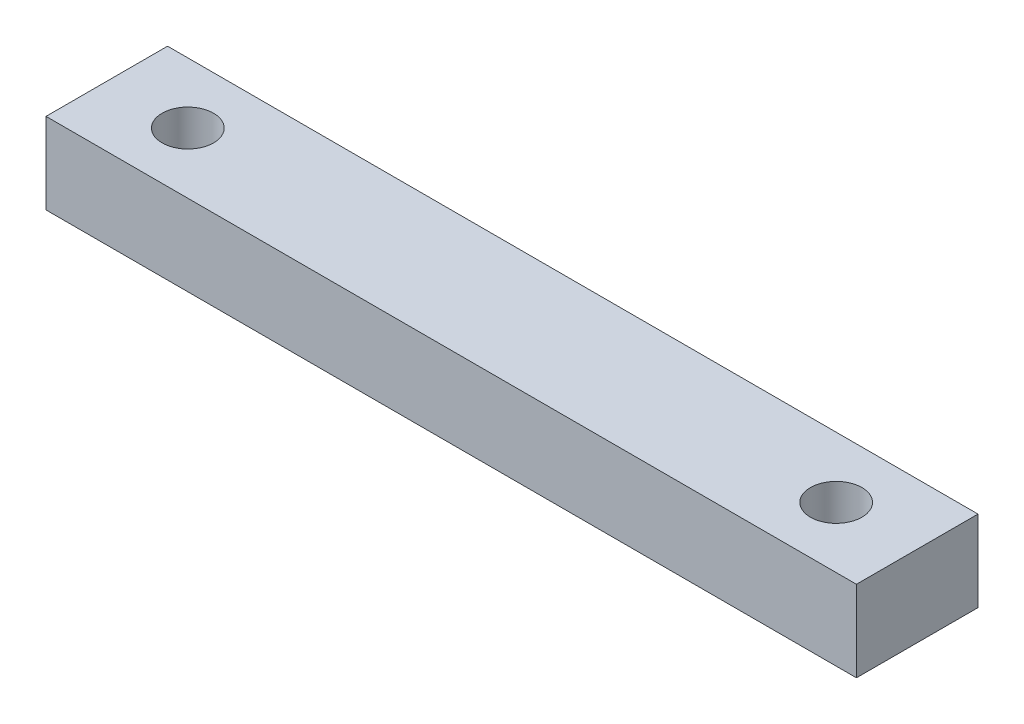
ISO-10303-21;
HEADER;
FILE_DESCRIPTION(('STEP AP214'),'2;1');
FILE_NAME('part.step','',(''),(''),'','','');
FILE_SCHEMA(('AUTOMOTIVE_DESIGN { 1 0 10303 214 1 1 1 1 }'));
ENDSEC;
DATA;
#1=APPLICATION_CONTEXT('core data for automotive mechanical design processes');
#2=APPLICATION_PROTOCOL_DEFINITION('international standard','automotive_design',2000,#1);
#3=PRODUCT_CONTEXT('',#1,'mechanical');
#4=PRODUCT('Part','Part','',(#3));
#5=PRODUCT_RELATED_PRODUCT_CATEGORY('part','',(#4));
#6=PRODUCT_DEFINITION_FORMATION('','',#4);
#7=PRODUCT_DEFINITION_CONTEXT('part definition',#1,'design');
#8=PRODUCT_DEFINITION('design','',#6,#7);
#9=PRODUCT_DEFINITION_SHAPE('','',#8);
#10=(LENGTH_UNIT() NAMED_UNIT(*) SI_UNIT(.MILLI.,.METRE.));
#11=(NAMED_UNIT(*) PLANE_ANGLE_UNIT() SI_UNIT($,.RADIAN.));
#12=(NAMED_UNIT(*) SI_UNIT($,.STERADIAN.) SOLID_ANGLE_UNIT());
#13=UNCERTAINTY_MEASURE_WITH_UNIT(LENGTH_MEASURE(1.E-05),#10,'distance_accuracy_value','');
#14=(GEOMETRIC_REPRESENTATION_CONTEXT(3) GLOBAL_UNCERTAINTY_ASSIGNED_CONTEXT((#13)) GLOBAL_UNIT_ASSIGNED_CONTEXT((#10,
#11,#12)) REPRESENTATION_CONTEXT('',''));
#15=CARTESIAN_POINT('',(0.,0.,0.));
#16=DIRECTION('',(0.,0.,1.));
#17=DIRECTION('',(1.,0.,0.));
#18=AXIS2_PLACEMENT_3D('',#15,#16,#17);
#19=CARTESIAN_POINT('',(0.,10.,0.));
#20=DIRECTION('',(0.,-1.,0.));
#21=DIRECTION('',(0.,0.,-1.));
#22=AXIS2_PLACEMENT_3D('',#19,#20,#21);
#23=PLANE('',#22);
#24=DIRECTION('',(0.,0.,1.));
#25=VECTOR('',#24,1.);
#26=CARTESIAN_POINT('',(0.,10.,0.));
#27=LINE('',#26,#25);
#28=CARTESIAN_POINT('',(0.,10.,-15.));
#29=VERTEX_POINT('',#28);
#30=CARTESIAN_POINT('',(0.,10.,0.));
#31=VERTEX_POINT('',#30);
#32=EDGE_CURVE('E85',#29,#31,#27,.T.);
#33=ORIENTED_EDGE('',*,*,#32,.T.);
#34=DIRECTION('',(1.,0.,0.));
#35=VECTOR('',#34,1.);
#36=CARTESIAN_POINT('',(0.,10.,0.));
#37=LINE('',#36,#35);
#38=CARTESIAN_POINT('',(100.,10.,0.));
#39=VERTEX_POINT('',#38);
#40=EDGE_CURVE('E80',#31,#39,#37,.T.);
#41=ORIENTED_EDGE('',*,*,#40,.T.);
#42=DIRECTION('',(0.,0.,-1.));
#43=VECTOR('',#42,1.);
#44=CARTESIAN_POINT('',(100.,10.,0.));
#45=LINE('',#44,#43);
#46=CARTESIAN_POINT('',(100.,10.,-15.));
#47=VERTEX_POINT('',#46);
#48=EDGE_CURVE('E83',#39,#47,#45,.T.);
#49=ORIENTED_EDGE('',*,*,#48,.T.);
#50=DIRECTION('',(-1.,0.,0.));
#51=VECTOR('',#50,1.);
#52=CARTESIAN_POINT('',(0.,10.,-15.));
#53=LINE('',#52,#51);
#54=EDGE_CURVE('E50',#47,#29,#53,.T.);
#55=ORIENTED_EDGE('',*,*,#54,.T.);
#56=EDGE_LOOP('',(#33,#41,#49,#55));
#57=FACE_BOUND('',#56,.T.);
#58=CARTESIAN_POINT('',(10.,10.,-7.5));
#59=DIRECTION('',(0.,1.,0.));
#60=DIRECTION('',(0.,0.,1.));
#61=AXIS2_PLACEMENT_3D('',#58,#59,#60);
#62=CIRCLE('',#61,3.175);
#63=CARTESIAN_POINT('',(10.,10.,-4.325));
#64=VERTEX_POINT('',#63);
#65=EDGE_CURVE('E100',#64,#64,#62,.T.);
#66=ORIENTED_EDGE('',*,*,#65,.F.);
#67=EDGE_LOOP('',(#66));
#68=FACE_BOUND('',#67,.T.);
#69=CARTESIAN_POINT('',(90.,10.,-7.5));
#70=DIRECTION('',(0.,1.,0.));
#71=DIRECTION('',(0.,0.,-1.));
#72=AXIS2_PLACEMENT_3D('',#69,#70,#71);
#73=CIRCLE('',#72,3.175);
#74=CARTESIAN_POINT('',(90.,10.,-10.675));
#75=VERTEX_POINT('',#74);
#76=EDGE_CURVE('E115',#75,#75,#73,.T.);
#77=ORIENTED_EDGE('',*,*,#76,.F.);
#78=EDGE_LOOP('',(#77));
#79=FACE_BOUND('',#78,.T.);
#80=ADVANCED_FACE('F33',(#57,#68,#79),#23,.F.);
#81=CARTESIAN_POINT('',(0.,0.,0.));
#82=DIRECTION('',(0.,-1.,0.));
#83=DIRECTION('',(0.,0.,-1.));
#84=AXIS2_PLACEMENT_3D('',#81,#82,#83);
#85=PLANE('',#84);
#86=CARTESIAN_POINT('',(10.,0.,-7.5));
#87=DIRECTION('',(0.,1.,0.));
#88=DIRECTION('',(0.,0.,1.));
#89=AXIS2_PLACEMENT_3D('',#86,#87,#88);
#90=CIRCLE('',#89,3.175);
#91=CARTESIAN_POINT('',(10.,0.,-4.325));
#92=VERTEX_POINT('',#91);
#93=EDGE_CURVE('E112',#92,#92,#90,.T.);
#94=ORIENTED_EDGE('',*,*,#93,.T.);
#95=EDGE_LOOP('',(#94));
#96=FACE_BOUND('',#95,.T.);
#97=DIRECTION('',(0.,0.,1.));
#98=VECTOR('',#97,1.);
#99=CARTESIAN_POINT('',(0.,0.,0.));
#100=LINE('',#99,#98);
#101=CARTESIAN_POINT('',(0.,0.,-15.));
#102=VERTEX_POINT('',#101);
#103=CARTESIAN_POINT('',(0.,0.,0.));
#104=VERTEX_POINT('',#103);
#105=EDGE_CURVE('E97',#102,#104,#100,.T.);
#106=ORIENTED_EDGE('',*,*,#105,.F.);
#107=DIRECTION('',(-1.,0.,0.));
#108=VECTOR('',#107,1.);
#109=CARTESIAN_POINT('',(0.,0.,-15.));
#110=LINE('',#109,#108);
#111=CARTESIAN_POINT('',(100.,0.,-15.));
#112=VERTEX_POINT('',#111);
#113=EDGE_CURVE('E73',#112,#102,#110,.T.);
#114=ORIENTED_EDGE('',*,*,#113,.F.);
#115=DIRECTION('',(0.,0.,-1.));
#116=VECTOR('',#115,1.);
#117=CARTESIAN_POINT('',(100.,0.,0.));
#118=LINE('',#117,#116);
#119=CARTESIAN_POINT('',(100.,0.,0.));
#120=VERTEX_POINT('',#119);
#121=EDGE_CURVE('E67',#120,#112,#118,.T.);
#122=ORIENTED_EDGE('',*,*,#121,.F.);
#123=DIRECTION('',(1.,0.,0.));
#124=VECTOR('',#123,1.);
#125=CARTESIAN_POINT('',(0.,0.,0.));
#126=LINE('',#125,#124);
#127=EDGE_CURVE('E89',#104,#120,#126,.T.);
#128=ORIENTED_EDGE('',*,*,#127,.F.);
#129=EDGE_LOOP('',(#106,#114,#122,#128));
#130=FACE_BOUND('',#129,.T.);
#131=CARTESIAN_POINT('',(90.,0.,-7.5));
#132=DIRECTION('',(0.,1.,0.));
#133=DIRECTION('',(0.,0.,-1.));
#134=AXIS2_PLACEMENT_3D('',#131,#132,#133);
#135=CIRCLE('',#134,3.175);
#136=CARTESIAN_POINT('',(90.,0.,-10.675));
#137=VERTEX_POINT('',#136);
#138=EDGE_CURVE('E118',#137,#137,#135,.T.);
#139=ORIENTED_EDGE('',*,*,#138,.T.);
#140=EDGE_LOOP('',(#139));
#141=FACE_BOUND('',#140,.T.);
#142=ADVANCED_FACE('F108',(#96,#130,#141),#85,.T.);
#143=CARTESIAN_POINT('',(0.,10.,0.));
#144=DIRECTION('',(1.,0.,0.));
#145=DIRECTION('',(0.,0.,-1.));
#146=AXIS2_PLACEMENT_3D('',#143,#144,#145);
#147=PLANE('',#146);
#148=ORIENTED_EDGE('',*,*,#105,.T.);
#149=DIRECTION('',(0.,-1.,0.));
#150=VECTOR('',#149,1.);
#151=CARTESIAN_POINT('',(0.,10.,0.));
#152=LINE('',#151,#150);
#153=EDGE_CURVE('E11',#31,#104,#152,.T.);
#154=ORIENTED_EDGE('',*,*,#153,.F.);
#155=ORIENTED_EDGE('',*,*,#32,.F.);
#156=DIRECTION('',(0.,-1.,0.));
#157=VECTOR('',#156,1.);
#158=CARTESIAN_POINT('',(0.,10.,-15.));
#159=LINE('',#158,#157);
#160=EDGE_CURVE('E93',#29,#102,#159,.T.);
#161=ORIENTED_EDGE('',*,*,#160,.T.);
#162=EDGE_LOOP('',(#148,#154,#155,#161));
#163=FACE_BOUND('',#162,.T.);
#164=ADVANCED_FACE('F35',(#163),#147,.F.);
#165=CARTESIAN_POINT('',(0.,10.,0.));
#166=DIRECTION('',(0.,0.,-1.));
#167=DIRECTION('',(-1.,0.,0.));
#168=AXIS2_PLACEMENT_3D('',#165,#166,#167);
#169=PLANE('',#168);
#170=ORIENTED_EDGE('',*,*,#127,.T.);
#171=DIRECTION('',(0.,-1.,0.));
#172=VECTOR('',#171,1.);
#173=CARTESIAN_POINT('',(100.,10.,0.));
#174=LINE('',#173,#172);
#175=EDGE_CURVE('E42',#39,#120,#174,.T.);
#176=ORIENTED_EDGE('',*,*,#175,.F.);
#177=ORIENTED_EDGE('',*,*,#40,.F.);
#178=ORIENTED_EDGE('',*,*,#153,.T.);
#179=EDGE_LOOP('',(#170,#176,#177,#178));
#180=FACE_BOUND('',#179,.T.);
#181=ADVANCED_FACE('F88',(#180),#169,.F.);
#182=CARTESIAN_POINT('',(100.,10.,0.));
#183=DIRECTION('',(-1.,0.,0.));
#184=DIRECTION('',(0.,0.,1.));
#185=AXIS2_PLACEMENT_3D('',#182,#183,#184);
#186=PLANE('',#185);
#187=ORIENTED_EDGE('',*,*,#121,.T.);
#188=DIRECTION('',(0.,-1.,0.));
#189=VECTOR('',#188,1.);
#190=CARTESIAN_POINT('',(100.,10.,-15.));
#191=LINE('',#190,#189);
#192=EDGE_CURVE('E90',#47,#112,#191,.T.);
#193=ORIENTED_EDGE('',*,*,#192,.F.);
#194=ORIENTED_EDGE('',*,*,#48,.F.);
#195=ORIENTED_EDGE('',*,*,#175,.T.);
#196=EDGE_LOOP('',(#187,#193,#194,#195));
#197=FACE_BOUND('',#196,.T.);
#198=ADVANCED_FACE('F91',(#197),#186,.F.);
#199=CARTESIAN_POINT('',(0.,10.,-15.));
#200=DIRECTION('',(0.,0.,1.));
#201=DIRECTION('',(1.,0.,0.));
#202=AXIS2_PLACEMENT_3D('',#199,#200,#201);
#203=PLANE('',#202);
#204=ORIENTED_EDGE('',*,*,#113,.T.);
#205=ORIENTED_EDGE('',*,*,#160,.F.);
#206=ORIENTED_EDGE('',*,*,#54,.F.);
#207=ORIENTED_EDGE('',*,*,#192,.T.);
#208=EDGE_LOOP('',(#204,#205,#206,#207));
#209=FACE_BOUND('',#208,.T.);
#210=ADVANCED_FACE('F105',(#209),#203,.F.);
#211=CARTESIAN_POINT('',(10.,10.,-7.5));
#212=DIRECTION('',(0.,-1.,0.));
#213=DIRECTION('',(0.,0.,-1.));
#214=AXIS2_PLACEMENT_3D('',#211,#212,#213);
#215=CYLINDRICAL_SURFACE('',#214,3.175);
#216=ORIENTED_EDGE('',*,*,#65,.T.);
#217=EDGE_LOOP('',(#216));
#218=FACE_BOUND('',#217,.T.);
#219=ORIENTED_EDGE('',*,*,#93,.F.);
#220=EDGE_LOOP('',(#219));
#221=FACE_BOUND('',#220,.T.);
#222=ADVANCED_FACE('F135',(#218,#221),#215,.F.);
#223=CARTESIAN_POINT('',(90.,10.,-7.5));
#224=DIRECTION('',(0.,-1.,0.));
#225=DIRECTION('',(0.,0.,-1.));
#226=AXIS2_PLACEMENT_3D('',#223,#224,#225);
#227=CYLINDRICAL_SURFACE('',#226,3.175);
#228=ORIENTED_EDGE('',*,*,#76,.T.);
#229=EDGE_LOOP('',(#228));
#230=FACE_BOUND('',#229,.T.);
#231=ORIENTED_EDGE('',*,*,#138,.F.);
#232=EDGE_LOOP('',(#231));
#233=FACE_BOUND('',#232,.T.);
#234=ADVANCED_FACE('F124',(#230,#233),#227,.F.);
#235=CLOSED_SHELL('',(#80,#142,#164,#181,#198,#210,#222,#234));
#236=MANIFOLD_SOLID_BREP('B2',#235);
#237=ADVANCED_BREP_SHAPE_REPRESENTATION('',(#18,#236),#14);
#238=SHAPE_DEFINITION_REPRESENTATION(#9,#237);
ENDSEC;
END-ISO-10303-21;
